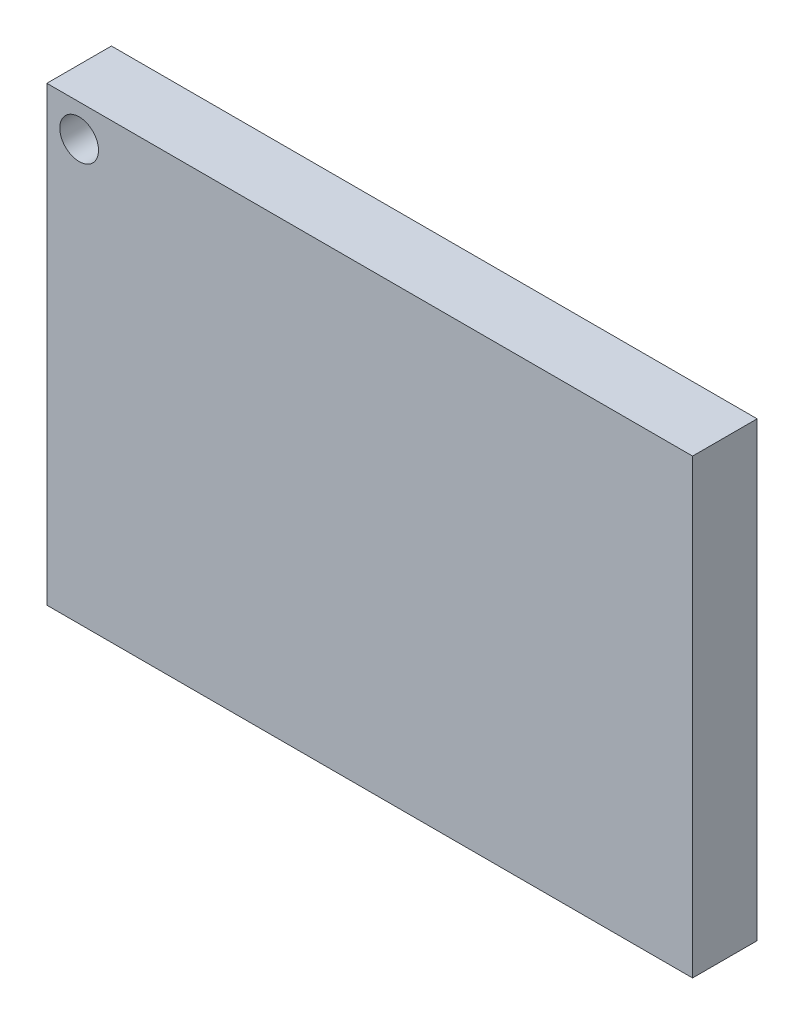
ISO-10303-21;
HEADER;
FILE_DESCRIPTION(('STEP AP214'),'2;1');
FILE_NAME('part.step','',(''),(''),'','','');
FILE_SCHEMA(('AUTOMOTIVE_DESIGN { 1 0 10303 214 1 1 1 1 }'));
ENDSEC;
DATA;
#1=APPLICATION_CONTEXT('core data for automotive mechanical design processes');
#2=APPLICATION_PROTOCOL_DEFINITION('international standard','automotive_design',2000,#1);
#3=PRODUCT_CONTEXT('',#1,'mechanical');
#4=PRODUCT('Part','Part','',(#3));
#5=PRODUCT_RELATED_PRODUCT_CATEGORY('part','',(#4));
#6=PRODUCT_DEFINITION_FORMATION('','',#4);
#7=PRODUCT_DEFINITION_CONTEXT('part definition',#1,'design');
#8=PRODUCT_DEFINITION('design','',#6,#7);
#9=PRODUCT_DEFINITION_SHAPE('','',#8);
#10=(LENGTH_UNIT() NAMED_UNIT(*) SI_UNIT(.MILLI.,.METRE.));
#11=(NAMED_UNIT(*) PLANE_ANGLE_UNIT() SI_UNIT($,.RADIAN.));
#12=(NAMED_UNIT(*) SI_UNIT($,.STERADIAN.) SOLID_ANGLE_UNIT());
#13=UNCERTAINTY_MEASURE_WITH_UNIT(LENGTH_MEASURE(1.E-05),#10,'distance_accuracy_value','');
#14=(GEOMETRIC_REPRESENTATION_CONTEXT(3) GLOBAL_UNCERTAINTY_ASSIGNED_CONTEXT((#13)) GLOBAL_UNIT_ASSIGNED_CONTEXT((#10,
#11,#12)) REPRESENTATION_CONTEXT('',''));
#15=CARTESIAN_POINT('',(0.,0.,0.));
#16=DIRECTION('',(0.,0.,1.));
#17=DIRECTION('',(1.,0.,0.));
#18=AXIS2_PLACEMENT_3D('',#15,#16,#17);
#19=CARTESIAN_POINT('',(50.,35.,5.));
#20=DIRECTION('',(-1.,0.,0.));
#21=DIRECTION('',(0.,0.,1.));
#22=AXIS2_PLACEMENT_3D('',#19,#20,#21);
#23=PLANE('',#22);
#24=DIRECTION('',(0.,1.,0.));
#25=VECTOR('',#24,1.);
#26=CARTESIAN_POINT('',(50.,35.,-5.));
#27=LINE('',#26,#25);
#28=CARTESIAN_POINT('',(50.,-35.,-5.));
#29=VERTEX_POINT('',#28);
#30=CARTESIAN_POINT('',(50.,35.,-5.));
#31=VERTEX_POINT('',#30);
#32=EDGE_CURVE('E100',#29,#31,#27,.T.);
#33=ORIENTED_EDGE('',*,*,#32,.T.);
#34=DIRECTION('',(0.,0.,-1.));
#35=VECTOR('',#34,1.);
#36=CARTESIAN_POINT('',(50.,35.,5.));
#37=LINE('',#36,#35);
#38=CARTESIAN_POINT('',(50.,35.,5.));
#39=VERTEX_POINT('',#38);
#40=EDGE_CURVE('E11',#39,#31,#37,.T.);
#41=ORIENTED_EDGE('',*,*,#40,.F.);
#42=DIRECTION('',(0.,1.,0.));
#43=VECTOR('',#42,1.);
#44=CARTESIAN_POINT('',(50.,35.,5.));
#45=LINE('',#44,#43);
#46=CARTESIAN_POINT('',(50.,-35.,5.));
#47=VERTEX_POINT('',#46);
#48=EDGE_CURVE('E88',#47,#39,#45,.T.);
#49=ORIENTED_EDGE('',*,*,#48,.F.);
#50=DIRECTION('',(0.,0.,-1.));
#51=VECTOR('',#50,1.);
#52=CARTESIAN_POINT('',(50.,-35.,5.));
#53=LINE('',#52,#51);
#54=EDGE_CURVE('E96',#47,#29,#53,.T.);
#55=ORIENTED_EDGE('',*,*,#54,.T.);
#56=EDGE_LOOP('',(#33,#41,#49,#55));
#57=FACE_BOUND('',#56,.T.);
#58=ADVANCED_FACE('F37',(#57),#23,.F.);
#59=CARTESIAN_POINT('',(-50.,35.,5.));
#60=DIRECTION('',(0.,-1.,0.));
#61=DIRECTION('',(0.,0.,-1.));
#62=AXIS2_PLACEMENT_3D('',#59,#60,#61);
#63=PLANE('',#62);
#64=DIRECTION('',(-1.,0.,0.));
#65=VECTOR('',#64,1.);
#66=CARTESIAN_POINT('',(-50.,35.,-5.));
#67=LINE('',#66,#65);
#68=CARTESIAN_POINT('',(-50.,35.,-5.));
#69=VERTEX_POINT('',#68);
#70=EDGE_CURVE('E92',#31,#69,#67,.T.);
#71=ORIENTED_EDGE('',*,*,#70,.T.);
#72=DIRECTION('',(0.,0.,-1.));
#73=VECTOR('',#72,1.);
#74=CARTESIAN_POINT('',(-50.,35.,5.));
#75=LINE('',#74,#73);
#76=CARTESIAN_POINT('',(-50.,35.,5.));
#77=VERTEX_POINT('',#76);
#78=EDGE_CURVE('E45',#77,#69,#75,.T.);
#79=ORIENTED_EDGE('',*,*,#78,.F.);
#80=DIRECTION('',(-1.,0.,0.));
#81=VECTOR('',#80,1.);
#82=CARTESIAN_POINT('',(-50.,35.,5.));
#83=LINE('',#82,#81);
#84=EDGE_CURVE('E83',#39,#77,#83,.T.);
#85=ORIENTED_EDGE('',*,*,#84,.F.);
#86=ORIENTED_EDGE('',*,*,#40,.T.);
#87=EDGE_LOOP('',(#71,#79,#85,#86));
#88=FACE_BOUND('',#87,.T.);
#89=ADVANCED_FACE('F91',(#88),#63,.F.);
#90=CARTESIAN_POINT('',(-50.,35.,5.));
#91=DIRECTION('',(1.,0.,0.));
#92=DIRECTION('',(0.,1.,0.));
#93=AXIS2_PLACEMENT_3D('',#90,#91,#92);
#94=PLANE('',#93);
#95=DIRECTION('',(0.,-1.,0.));
#96=VECTOR('',#95,1.);
#97=CARTESIAN_POINT('',(-50.,35.,-5.));
#98=LINE('',#97,#96);
#99=CARTESIAN_POINT('',(-50.,-35.,-5.));
#100=VERTEX_POINT('',#99);
#101=EDGE_CURVE('E70',#69,#100,#98,.T.);
#102=ORIENTED_EDGE('',*,*,#101,.T.);
#103=DIRECTION('',(0.,0.,-1.));
#104=VECTOR('',#103,1.);
#105=CARTESIAN_POINT('',(-50.,-35.,5.));
#106=LINE('',#105,#104);
#107=CARTESIAN_POINT('',(-50.,-35.,5.));
#108=VERTEX_POINT('',#107);
#109=EDGE_CURVE('E93',#108,#100,#106,.T.);
#110=ORIENTED_EDGE('',*,*,#109,.F.);
#111=DIRECTION('',(0.,-1.,0.));
#112=VECTOR('',#111,1.);
#113=CARTESIAN_POINT('',(-50.,35.,5.));
#114=LINE('',#113,#112);
#115=EDGE_CURVE('E86',#77,#108,#114,.T.);
#116=ORIENTED_EDGE('',*,*,#115,.F.);
#117=ORIENTED_EDGE('',*,*,#78,.T.);
#118=EDGE_LOOP('',(#102,#110,#116,#117));
#119=FACE_BOUND('',#118,.T.);
#120=ADVANCED_FACE('F94',(#119),#94,.F.);
#121=CARTESIAN_POINT('',(-50.,-35.,5.));
#122=DIRECTION('',(0.,1.,0.));
#123=DIRECTION('',(0.,0.,1.));
#124=AXIS2_PLACEMENT_3D('',#121,#122,#123);
#125=PLANE('',#124);
#126=DIRECTION('',(1.,0.,0.));
#127=VECTOR('',#126,1.);
#128=CARTESIAN_POINT('',(-50.,-35.,-5.));
#129=LINE('',#128,#127);
#130=EDGE_CURVE('E76',#100,#29,#129,.T.);
#131=ORIENTED_EDGE('',*,*,#130,.T.);
#132=ORIENTED_EDGE('',*,*,#54,.F.);
#133=DIRECTION('',(1.,0.,0.));
#134=VECTOR('',#133,1.);
#135=CARTESIAN_POINT('',(-50.,-35.,5.));
#136=LINE('',#135,#134);
#137=EDGE_CURVE('E53',#108,#47,#136,.T.);
#138=ORIENTED_EDGE('',*,*,#137,.F.);
#139=ORIENTED_EDGE('',*,*,#109,.T.);
#140=EDGE_LOOP('',(#131,#132,#138,#139));
#141=FACE_BOUND('',#140,.T.);
#142=ADVANCED_FACE('F108',(#141),#125,.F.);
#143=CARTESIAN_POINT('',(0.,0.,5.));
#144=DIRECTION('',(0.,0.,1.));
#145=DIRECTION('',(1.,0.,0.));
#146=AXIS2_PLACEMENT_3D('',#143,#144,#145);
#147=PLANE('',#146);
#148=CARTESIAN_POINT('',(-45.,30.,5.));
#149=DIRECTION('',(0.,0.,1.));
#150=DIRECTION('',(1.,0.,0.));
#151=AXIS2_PLACEMENT_3D('',#148,#149,#150);
#152=CIRCLE('',#151,3.);
#153=CARTESIAN_POINT('',(-42.,30.,5.));
#154=VERTEX_POINT('',#153);
#155=EDGE_CURVE('E114',#154,#154,#152,.T.);
#156=ORIENTED_EDGE('',*,*,#155,.F.);
#157=EDGE_LOOP('',(#156));
#158=FACE_BOUND('',#157,.T.);
#159=ORIENTED_EDGE('',*,*,#48,.T.);
#160=ORIENTED_EDGE('',*,*,#84,.T.);
#161=ORIENTED_EDGE('',*,*,#115,.T.);
#162=ORIENTED_EDGE('',*,*,#137,.T.);
#163=EDGE_LOOP('',(#159,#160,#161,#162));
#164=FACE_BOUND('',#163,.T.);
#165=ADVANCED_FACE('F84',(#158,#164),#147,.T.);
#166=CARTESIAN_POINT('',(0.,0.,-5.));
#167=DIRECTION('',(0.,0.,1.));
#168=DIRECTION('',(1.,0.,0.));
#169=AXIS2_PLACEMENT_3D('',#166,#167,#168);
#170=PLANE('',#169);
#171=CARTESIAN_POINT('',(-45.,30.,-5.));
#172=DIRECTION('',(0.,0.,1.));
#173=DIRECTION('',(1.,0.,0.));
#174=AXIS2_PLACEMENT_3D('',#171,#172,#173);
#175=CIRCLE('',#174,3.);
#176=CARTESIAN_POINT('',(-42.,30.,-5.));
#177=VERTEX_POINT('',#176);
#178=EDGE_CURVE('E103',#177,#177,#175,.T.);
#179=ORIENTED_EDGE('',*,*,#178,.T.);
#180=EDGE_LOOP('',(#179));
#181=FACE_BOUND('',#180,.T.);
#182=ORIENTED_EDGE('',*,*,#32,.F.);
#183=ORIENTED_EDGE('',*,*,#130,.F.);
#184=ORIENTED_EDGE('',*,*,#101,.F.);
#185=ORIENTED_EDGE('',*,*,#70,.F.);
#186=EDGE_LOOP('',(#182,#183,#184,#185));
#187=FACE_BOUND('',#186,.T.);
#188=ADVANCED_FACE('F111',(#181,#187),#170,.F.);
#189=CARTESIAN_POINT('',(-45.,30.,-5.));
#190=DIRECTION('',(0.,0.,1.));
#191=DIRECTION('',(1.,0.,0.));
#192=AXIS2_PLACEMENT_3D('',#189,#190,#191);
#193=CYLINDRICAL_SURFACE('',#192,3.);
#194=ORIENTED_EDGE('',*,*,#178,.F.);
#195=EDGE_LOOP('',(#194));
#196=FACE_BOUND('',#195,.T.);
#197=ORIENTED_EDGE('',*,*,#155,.T.);
#198=EDGE_LOOP('',(#197));
#199=FACE_BOUND('',#198,.T.);
#200=ADVANCED_FACE('F121',(#196,#199),#193,.F.);
#201=CLOSED_SHELL('',(#58,#89,#120,#142,#165,#188,#200));
#202=MANIFOLD_SOLID_BREP('B2',#201);
#203=ADVANCED_BREP_SHAPE_REPRESENTATION('',(#18,#202),#14);
#204=SHAPE_DEFINITION_REPRESENTATION(#9,#203);
ENDSEC;
END-ISO-10303-21;
